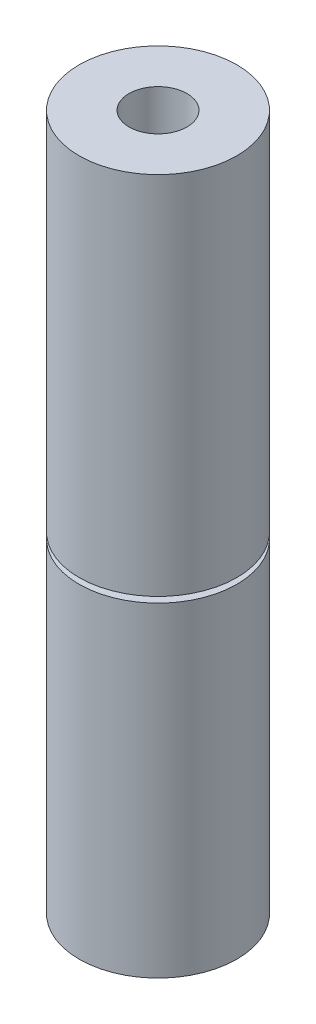
ISO-10303-21;
HEADER;
FILE_DESCRIPTION(('STEP AP214'),'2;1');
FILE_NAME('part.step','',(''),(''),'','','');
FILE_SCHEMA(('AUTOMOTIVE_DESIGN { 1 0 10303 214 1 1 1 1 }'));
ENDSEC;
DATA;
#1=APPLICATION_CONTEXT('core data for automotive mechanical design processes');
#2=APPLICATION_PROTOCOL_DEFINITION('international standard','automotive_design',2000,#1);
#3=PRODUCT_CONTEXT('',#1,'mechanical');
#4=PRODUCT('Part','Part','',(#3));
#5=PRODUCT_RELATED_PRODUCT_CATEGORY('part','',(#4));
#6=PRODUCT_DEFINITION_FORMATION('','',#4);
#7=PRODUCT_DEFINITION_CONTEXT('part definition',#1,'design');
#8=PRODUCT_DEFINITION('design','',#6,#7);
#9=PRODUCT_DEFINITION_SHAPE('','',#8);
#10=(LENGTH_UNIT() NAMED_UNIT(*) SI_UNIT(.MILLI.,.METRE.));
#11=(NAMED_UNIT(*) PLANE_ANGLE_UNIT() SI_UNIT($,.RADIAN.));
#12=(NAMED_UNIT(*) SI_UNIT($,.STERADIAN.) SOLID_ANGLE_UNIT());
#13=UNCERTAINTY_MEASURE_WITH_UNIT(LENGTH_MEASURE(1.E-05),#10,'distance_accuracy_value','');
#14=(GEOMETRIC_REPRESENTATION_CONTEXT(3) GLOBAL_UNCERTAINTY_ASSIGNED_CONTEXT((#13)) GLOBAL_UNIT_ASSIGNED_CONTEXT((#10,
#11,#12)) REPRESENTATION_CONTEXT('',''));
#15=CARTESIAN_POINT('',(0.,0.,0.));
#16=DIRECTION('',(0.,0.,1.));
#17=DIRECTION('',(1.,0.,0.));
#18=AXIS2_PLACEMENT_3D('',#15,#16,#17);
#19=CARTESIAN_POINT('',(0.,381.,0.));
#20=DIRECTION('',(0.,-1.,0.));
#21=DIRECTION('',(0.,0.,-1.));
#22=AXIS2_PLACEMENT_3D('',#19,#20,#21);
#23=CYLINDRICAL_SURFACE('',#22,43.18);
#24=CARTESIAN_POINT('',(0.,381.,0.));
#25=DIRECTION('',(0.,1.,0.));
#26=DIRECTION('',(0.,0.,1.));
#27=AXIS2_PLACEMENT_3D('',#24,#25,#26);
#28=CIRCLE('',#27,43.18);
#29=CARTESIAN_POINT('',(0.,381.,43.18));
#30=VERTEX_POINT('',#29);
#31=EDGE_CURVE('E11',#30,#30,#28,.T.);
#32=ORIENTED_EDGE('',*,*,#31,.F.);
#33=EDGE_LOOP('',(#32));
#34=FACE_BOUND('',#33,.T.);
#35=CARTESIAN_POINT('',(0.,180.975,0.));
#36=DIRECTION('',(0.,1.,0.));
#37=DIRECTION('',(0.,0.,1.));
#38=AXIS2_PLACEMENT_3D('',#35,#36,#37);
#39=CIRCLE('',#38,43.18);
#40=CARTESIAN_POINT('',(0.,180.975,43.18));
#41=VERTEX_POINT('',#40);
#42=EDGE_CURVE('E45',#41,#41,#39,.T.);
#43=ORIENTED_EDGE('',*,*,#42,.T.);
#44=EDGE_LOOP('',(#43));
#45=FACE_BOUND('',#44,.T.);
#46=ADVANCED_FACE('F41',(#34,#45),#23,.T.);
#47=CARTESIAN_POINT('',(0.,381.001,0.));
#48=DIRECTION('',(0.,-1.,0.));
#49=DIRECTION('',(0.,0.,-1.));
#50=AXIS2_PLACEMENT_3D('',#47,#48,#49);
#51=CYLINDRICAL_SURFACE('',#50,15.875);
#52=CARTESIAN_POINT('',(0.,180.975,0.));
#53=DIRECTION('',(0.,1.,0.));
#54=DIRECTION('',(0.,0.,1.));
#55=AXIS2_PLACEMENT_3D('',#52,#53,#54);
#56=CIRCLE('',#55,15.875);
#57=CARTESIAN_POINT('',(0.,180.975,15.875));
#58=VERTEX_POINT('',#57);
#59=EDGE_CURVE('E54',#58,#58,#56,.F.);
#60=ORIENTED_EDGE('',*,*,#59,.T.);
#61=EDGE_LOOP('',(#60));
#62=FACE_BOUND('',#61,.T.);
#63=CARTESIAN_POINT('',(0.,381.,0.));
#64=DIRECTION('',(0.,1.,0.));
#65=DIRECTION('',(0.,0.,1.));
#66=AXIS2_PLACEMENT_3D('',#63,#64,#65);
#67=CIRCLE('',#66,15.875);
#68=CARTESIAN_POINT('',(0.,381.,15.875));
#69=VERTEX_POINT('',#68);
#70=EDGE_CURVE('E49',#69,#69,#67,.F.);
#71=ORIENTED_EDGE('',*,*,#70,.F.);
#72=EDGE_LOOP('',(#71));
#73=FACE_BOUND('',#72,.T.);
#74=ADVANCED_FACE('F43',(#62,#73),#51,.F.);
#75=CARTESIAN_POINT('',(0.,381.,0.));
#76=DIRECTION('',(0.,1.,0.));
#77=DIRECTION('',(0.,0.,1.));
#78=AXIS2_PLACEMENT_3D('',#75,#76,#77);
#79=PLANE('',#78);
#80=ORIENTED_EDGE('',*,*,#70,.T.);
#81=EDGE_LOOP('',(#80));
#82=FACE_BOUND('',#81,.T.);
#83=ORIENTED_EDGE('',*,*,#31,.T.);
#84=EDGE_LOOP('',(#83));
#85=FACE_BOUND('',#84,.T.);
#86=ADVANCED_FACE('F65',(#82,#85),#79,.T.);
#87=CARTESIAN_POINT('',(-51.2367438654824,180.975,-43.18));
#88=DIRECTION('',(0.,1.,0.));
#89=DIRECTION('',(0.,0.,1.));
#90=AXIS2_PLACEMENT_3D('',#87,#88,#89);
#91=PLANE('',#90);
#92=ORIENTED_EDGE('',*,*,#59,.F.);
#93=EDGE_LOOP('',(#92));
#94=FACE_BOUND('',#93,.T.);
#95=ORIENTED_EDGE('',*,*,#42,.F.);
#96=EDGE_LOOP('',(#95));
#97=FACE_BOUND('',#96,.T.);
#98=ADVANCED_FACE('F63',(#94,#97),#91,.F.);
#99=CLOSED_SHELL('',(#46,#74,#86,#98));
#100=MANIFOLD_SOLID_BREP('B2',#99);
#101=CARTESIAN_POINT('',(0.,381.,0.));
#102=DIRECTION('',(0.,-1.,0.));
#103=DIRECTION('',(0.,0.,-1.));
#104=AXIS2_PLACEMENT_3D('',#101,#102,#103);
#105=CYLINDRICAL_SURFACE('',#104,43.18);
#106=CARTESIAN_POINT('',(0.,177.8,0.));
#107=DIRECTION('',(0.,-1.,0.));
#108=DIRECTION('',(0.,0.,-1.));
#109=AXIS2_PLACEMENT_3D('',#106,#107,#108);
#110=CIRCLE('',#109,43.18);
#111=CARTESIAN_POINT('',(0.,177.8,-43.18));
#112=VERTEX_POINT('',#111);
#113=EDGE_CURVE('E114',#112,#112,#110,.T.);
#114=ORIENTED_EDGE('',*,*,#113,.T.);
#115=EDGE_LOOP('',(#114));
#116=FACE_BOUND('',#115,.T.);
#117=CARTESIAN_POINT('',(0.,0.,0.));
#118=DIRECTION('',(0.,1.,0.));
#119=DIRECTION('',(0.,0.,1.));
#120=AXIS2_PLACEMENT_3D('',#117,#118,#119);
#121=CIRCLE('',#120,43.18);
#122=CARTESIAN_POINT('',(0.,0.,43.18));
#123=VERTEX_POINT('',#122);
#124=EDGE_CURVE('E40',#123,#123,#121,.T.);
#125=ORIENTED_EDGE('',*,*,#124,.T.);
#126=EDGE_LOOP('',(#125));
#127=FACE_BOUND('',#126,.T.);
#128=ADVANCED_FACE('F103',(#116,#127),#105,.T.);
#129=CARTESIAN_POINT('',(0.,0.,0.));
#130=DIRECTION('',(0.,1.,0.));
#131=DIRECTION('',(0.,0.,1.));
#132=AXIS2_PLACEMENT_3D('',#129,#130,#131);
#133=PLANE('',#132);
#134=CARTESIAN_POINT('',(0.,0.,0.));
#135=DIRECTION('',(0.,-1.,0.));
#136=DIRECTION('',(0.,0.,-1.));
#137=AXIS2_PLACEMENT_3D('',#134,#135,#136);
#138=CIRCLE('',#137,15.875);
#139=CARTESIAN_POINT('',(0.,0.,-15.875));
#140=VERTEX_POINT('',#139);
#141=EDGE_CURVE('E110',#140,#140,#138,.T.);
#142=ORIENTED_EDGE('',*,*,#141,.F.);
#143=EDGE_LOOP('',(#142));
#144=FACE_BOUND('',#143,.T.);
#145=ORIENTED_EDGE('',*,*,#124,.F.);
#146=EDGE_LOOP('',(#145));
#147=FACE_BOUND('',#146,.T.);
#148=ADVANCED_FACE('F133',(#144,#147),#133,.F.);
#149=CARTESIAN_POINT('',(0.,381.001,0.));
#150=DIRECTION('',(0.,-1.,0.));
#151=DIRECTION('',(0.,0.,-1.));
#152=AXIS2_PLACEMENT_3D('',#149,#150,#151);
#153=CYLINDRICAL_SURFACE('',#152,15.875);
#154=CARTESIAN_POINT('',(0.,177.8,0.));
#155=DIRECTION('',(0.,-1.,0.));
#156=DIRECTION('',(0.,0.,-1.));
#157=AXIS2_PLACEMENT_3D('',#154,#155,#156);
#158=CIRCLE('',#157,15.875);
#159=CARTESIAN_POINT('',(0.,177.8,-15.875));
#160=VERTEX_POINT('',#159);
#161=EDGE_CURVE('E106',#160,#160,#158,.F.);
#162=ORIENTED_EDGE('',*,*,#161,.T.);
#163=EDGE_LOOP('',(#162));
#164=FACE_BOUND('',#163,.T.);
#165=ORIENTED_EDGE('',*,*,#141,.T.);
#166=EDGE_LOOP('',(#165));
#167=FACE_BOUND('',#166,.T.);
#168=ADVANCED_FACE('F123',(#164,#167),#153,.F.);
#169=CARTESIAN_POINT('',(-51.2367438654824,177.8,-43.18));
#170=DIRECTION('',(0.,-1.,0.));
#171=DIRECTION('',(0.,0.,-1.));
#172=AXIS2_PLACEMENT_3D('',#169,#170,#171);
#173=PLANE('',#172);
#174=ORIENTED_EDGE('',*,*,#161,.F.);
#175=EDGE_LOOP('',(#174));
#176=FACE_BOUND('',#175,.T.);
#177=ORIENTED_EDGE('',*,*,#113,.F.);
#178=EDGE_LOOP('',(#177));
#179=FACE_BOUND('',#178,.T.);
#180=ADVANCED_FACE('F126',(#176,#179),#173,.F.);
#181=CLOSED_SHELL('',(#128,#148,#168,#180));
#182=MANIFOLD_SOLID_BREP('B6',#181);
#183=ADVANCED_BREP_SHAPE_REPRESENTATION('',(#18,#100,#182),#14);
#184=SHAPE_DEFINITION_REPRESENTATION(#9,#183);
ENDSEC;
END-ISO-10303-21;
